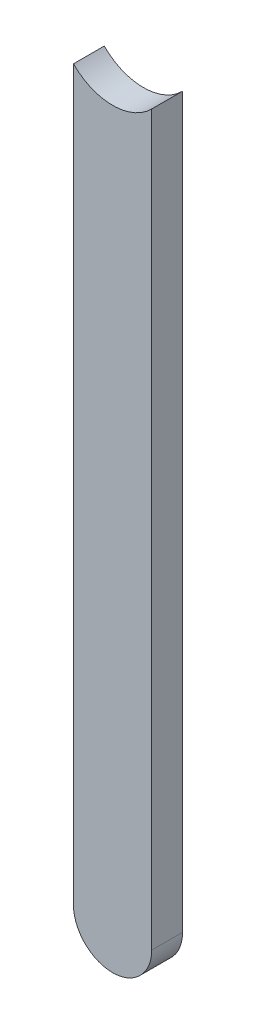
ISO-10303-21;
HEADER;
FILE_DESCRIPTION(('STEP AP214'),'2;1');
FILE_NAME('part.step','',(''),(''),'','','');
FILE_SCHEMA(('AUTOMOTIVE_DESIGN { 1 0 10303 214 1 1 1 1 }'));
ENDSEC;
DATA;
#1=APPLICATION_CONTEXT('core data for automotive mechanical design processes');
#2=APPLICATION_PROTOCOL_DEFINITION('international standard','automotive_design',2000,#1);
#3=PRODUCT_CONTEXT('',#1,'mechanical');
#4=PRODUCT('Part','Part','',(#3));
#5=PRODUCT_RELATED_PRODUCT_CATEGORY('part','',(#4));
#6=PRODUCT_DEFINITION_FORMATION('','',#4);
#7=PRODUCT_DEFINITION_CONTEXT('part definition',#1,'design');
#8=PRODUCT_DEFINITION('design','',#6,#7);
#9=PRODUCT_DEFINITION_SHAPE('','',#8);
#10=(LENGTH_UNIT() NAMED_UNIT(*) SI_UNIT(.MILLI.,.METRE.));
#11=(NAMED_UNIT(*) PLANE_ANGLE_UNIT() SI_UNIT($,.RADIAN.));
#12=(NAMED_UNIT(*) SI_UNIT($,.STERADIAN.) SOLID_ANGLE_UNIT());
#13=UNCERTAINTY_MEASURE_WITH_UNIT(LENGTH_MEASURE(1.E-05),#10,'distance_accuracy_value','');
#14=(GEOMETRIC_REPRESENTATION_CONTEXT(3) GLOBAL_UNCERTAINTY_ASSIGNED_CONTEXT((#13)) GLOBAL_UNIT_ASSIGNED_CONTEXT((#10,
#11,#12)) REPRESENTATION_CONTEXT('',''));
#15=CARTESIAN_POINT('',(0.,0.,0.));
#16=DIRECTION('',(0.,0.,1.));
#17=DIRECTION('',(1.,0.,0.));
#18=AXIS2_PLACEMENT_3D('',#15,#16,#17);
#19=CARTESIAN_POINT('',(118.4656,65.3796,0.));
#20=DIRECTION('',(-1.,0.,0.));
#21=DIRECTION('',(0.,1.,0.));
#22=AXIS2_PLACEMENT_3D('',#19,#20,#21);
#23=PLANE('',#22);
#24=DIRECTION('',(0.,1.,0.));
#25=VECTOR('',#24,1.);
#26=CARTESIAN_POINT('',(118.4656,65.3796,0.1999996));
#27=LINE('',#26,#25);
#28=CARTESIAN_POINT('',(118.4656,65.3796,0.1999996));
#29=VERTEX_POINT('',#28);
#30=CARTESIAN_POINT('',(118.4656,70.1091318421332,0.1999996));
#31=VERTEX_POINT('',#30);
#32=EDGE_CURVE('E11',#29,#31,#27,.T.);
#33=ORIENTED_EDGE('',*,*,#32,.F.);
#34=DIRECTION('',(0.,0.,1.));
#35=VECTOR('',#34,1.);
#36=CARTESIAN_POINT('',(118.4656,65.3796,0.));
#37=LINE('',#36,#35);
#38=CARTESIAN_POINT('',(118.4656,65.3796,0.));
#39=VERTEX_POINT('',#38);
#40=EDGE_CURVE('E24',#39,#29,#37,.T.);
#41=ORIENTED_EDGE('',*,*,#40,.F.);
#42=DIRECTION('',(0.,1.,0.));
#43=VECTOR('',#42,1.);
#44=CARTESIAN_POINT('',(118.4656,65.3796,0.));
#45=LINE('',#44,#43);
#46=CARTESIAN_POINT('',(118.4656,70.1091318421332,0.));
#47=VERTEX_POINT('',#46);
#48=EDGE_CURVE('E75',#39,#47,#45,.T.);
#49=ORIENTED_EDGE('',*,*,#48,.T.);
#50=DIRECTION('',(0.,0.,1.));
#51=VECTOR('',#50,1.);
#52=CARTESIAN_POINT('',(118.4656,70.1091318421332,0.));
#53=LINE('',#52,#51);
#54=EDGE_CURVE('E37',#47,#31,#53,.T.);
#55=ORIENTED_EDGE('',*,*,#54,.T.);
#56=EDGE_LOOP('',(#33,#41,#49,#55));
#57=FACE_BOUND('',#56,.T.);
#58=ADVANCED_FACE('F17',(#57),#23,.F.);
#59=CARTESIAN_POINT('',(118.2116,70.358,0.));
#60=DIRECTION('',(0.,0.,-1.));
#61=DIRECTION('',(1.,0.,0.));
#62=AXIS2_PLACEMENT_3D('',#59,#60,#61);
#63=CYLINDRICAL_SURFACE('',#62,0.3556);
#64=DIRECTION('',(0.,0.,1.));
#65=VECTOR('',#64,1.);
#66=CARTESIAN_POINT('',(117.9576,70.1091318421332,0.));
#67=LINE('',#66,#65);
#68=CARTESIAN_POINT('',(117.9576,70.1091318421332,0.));
#69=VERTEX_POINT('',#68);
#70=CARTESIAN_POINT('',(117.9576,70.1091318421332,0.1999996));
#71=VERTEX_POINT('',#70);
#72=EDGE_CURVE('E67',#69,#71,#67,.T.);
#73=ORIENTED_EDGE('',*,*,#72,.T.);
#74=CARTESIAN_POINT('',(118.2116,70.358,0.1999996));
#75=DIRECTION('',(0.,0.,1.));
#76=DIRECTION('',(1.,0.,0.));
#77=AXIS2_PLACEMENT_3D('',#74,#75,#76);
#78=CIRCLE('',#77,0.3556);
#79=EDGE_CURVE('E82',#71,#31,#78,.T.);
#80=ORIENTED_EDGE('',*,*,#79,.T.);
#81=ORIENTED_EDGE('',*,*,#54,.F.);
#82=CARTESIAN_POINT('',(118.2116,70.358,0.));
#83=DIRECTION('',(0.,0.,1.));
#84=DIRECTION('',(1.,0.,0.));
#85=AXIS2_PLACEMENT_3D('',#82,#83,#84);
#86=CIRCLE('',#85,0.3556);
#87=EDGE_CURVE('E80',#69,#47,#86,.T.);
#88=ORIENTED_EDGE('',*,*,#87,.F.);
#89=EDGE_LOOP('',(#73,#80,#81,#88));
#90=FACE_BOUND('',#89,.T.);
#91=ADVANCED_FACE('F88',(#90),#63,.F.);
#92=CARTESIAN_POINT('',(117.9576,70.1091318421332,0.));
#93=DIRECTION('',(1.,0.,0.));
#94=DIRECTION('',(0.,-1.,0.));
#95=AXIS2_PLACEMENT_3D('',#92,#93,#94);
#96=PLANE('',#95);
#97=DIRECTION('',(0.,-1.,0.));
#98=VECTOR('',#97,1.);
#99=CARTESIAN_POINT('',(117.9576,70.358,0.1999996));
#100=LINE('',#99,#98);
#101=CARTESIAN_POINT('',(117.9576,65.3796,0.1999996));
#102=VERTEX_POINT('',#101);
#103=EDGE_CURVE('E71',#71,#102,#100,.T.);
#104=ORIENTED_EDGE('',*,*,#103,.F.);
#105=ORIENTED_EDGE('',*,*,#72,.F.);
#106=DIRECTION('',(0.,-1.,0.));
#107=VECTOR('',#106,1.);
#108=CARTESIAN_POINT('',(117.9576,70.358,0.));
#109=LINE('',#108,#107);
#110=CARTESIAN_POINT('',(117.9576,65.3796,0.));
#111=VERTEX_POINT('',#110);
#112=EDGE_CURVE('E63',#69,#111,#109,.T.);
#113=ORIENTED_EDGE('',*,*,#112,.T.);
#114=DIRECTION('',(0.,0.,1.));
#115=VECTOR('',#114,1.);
#116=CARTESIAN_POINT('',(117.9576,65.3796,0.));
#117=LINE('',#116,#115);
#118=EDGE_CURVE('E53',#111,#102,#117,.T.);
#119=ORIENTED_EDGE('',*,*,#118,.T.);
#120=EDGE_LOOP('',(#104,#105,#113,#119));
#121=FACE_BOUND('',#120,.T.);
#122=ADVANCED_FACE('F66',(#121),#96,.F.);
#123=CARTESIAN_POINT('',(118.2116,65.3796,0.));
#124=DIRECTION('',(0.,0.,-1.));
#125=DIRECTION('',(-1.,0.,0.));
#126=AXIS2_PLACEMENT_3D('',#123,#124,#125);
#127=CYLINDRICAL_SURFACE('',#126,0.254);
#128=CARTESIAN_POINT('',(118.2116,65.3796,0.1999996));
#129=DIRECTION('',(0.,0.,1.));
#130=DIRECTION('',(-1.,0.,0.));
#131=AXIS2_PLACEMENT_3D('',#128,#129,#130);
#132=CIRCLE('',#131,0.254);
#133=EDGE_CURVE('E59',#102,#29,#132,.T.);
#134=ORIENTED_EDGE('',*,*,#133,.F.);
#135=ORIENTED_EDGE('',*,*,#118,.F.);
#136=CARTESIAN_POINT('',(118.2116,65.3796,0.));
#137=DIRECTION('',(0.,0.,1.));
#138=DIRECTION('',(-1.,0.,0.));
#139=AXIS2_PLACEMENT_3D('',#136,#137,#138);
#140=CIRCLE('',#139,0.254);
#141=EDGE_CURVE('E57',#111,#39,#140,.T.);
#142=ORIENTED_EDGE('',*,*,#141,.T.);
#143=ORIENTED_EDGE('',*,*,#40,.T.);
#144=EDGE_LOOP('',(#134,#135,#142,#143));
#145=FACE_BOUND('',#144,.T.);
#146=ADVANCED_FACE('F55',(#145),#127,.T.);
#147=CARTESIAN_POINT('',(118.4656,65.3796,0.));
#148=DIRECTION('',(0.,0.,-1.));
#149=DIRECTION('',(-1.,0.,0.));
#150=AXIS2_PLACEMENT_3D('',#147,#148,#149);
#151=PLANE('',#150);
#152=ORIENTED_EDGE('',*,*,#48,.F.);
#153=ORIENTED_EDGE('',*,*,#141,.F.);
#154=ORIENTED_EDGE('',*,*,#112,.F.);
#155=ORIENTED_EDGE('',*,*,#87,.T.);
#156=EDGE_LOOP('',(#152,#153,#154,#155));
#157=FACE_BOUND('',#156,.T.);
#158=ADVANCED_FACE('F74',(#157),#151,.T.);
#159=CARTESIAN_POINT('',(118.4656,65.3796,0.1999996));
#160=DIRECTION('',(0.,0.,-1.));
#161=DIRECTION('',(-1.,0.,0.));
#162=AXIS2_PLACEMENT_3D('',#159,#160,#161);
#163=PLANE('',#162);
#164=ORIENTED_EDGE('',*,*,#133,.T.);
#165=ORIENTED_EDGE('',*,*,#32,.T.);
#166=ORIENTED_EDGE('',*,*,#79,.F.);
#167=ORIENTED_EDGE('',*,*,#103,.T.);
#168=EDGE_LOOP('',(#164,#165,#166,#167));
#169=FACE_BOUND('',#168,.T.);
#170=ADVANCED_FACE('F91',(#169),#163,.F.);
#171=CLOSED_SHELL('',(#58,#91,#122,#146,#158,#170));
#172=MANIFOLD_SOLID_BREP('B1',#171);
#173=ADVANCED_BREP_SHAPE_REPRESENTATION('',(#18,#172),#14);
#174=SHAPE_DEFINITION_REPRESENTATION(#9,#173);
ENDSEC;
END-ISO-10303-21;
